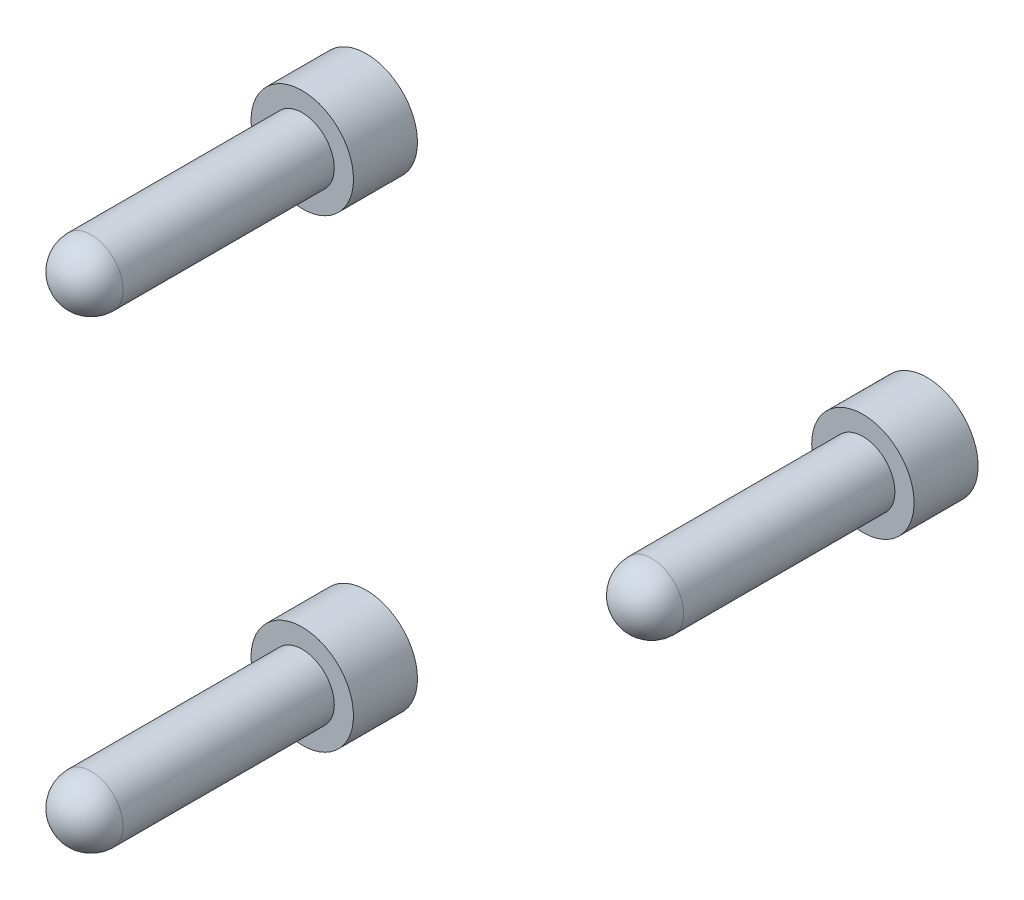
ISO-10303-21;
HEADER;
FILE_DESCRIPTION(('STEP AP214'),'2;1');
FILE_NAME('part.step','',(''),(''),'','','');
FILE_SCHEMA(('AUTOMOTIVE_DESIGN { 1 0 10303 214 1 1 1 1 }'));
ENDSEC;
DATA;
#1=APPLICATION_CONTEXT('core data for automotive mechanical design processes');
#2=APPLICATION_PROTOCOL_DEFINITION('international standard','automotive_design',2000,#1);
#3=PRODUCT_CONTEXT('',#1,'mechanical');
#4=PRODUCT('Part','Part','',(#3));
#5=PRODUCT_RELATED_PRODUCT_CATEGORY('part','',(#4));
#6=PRODUCT_DEFINITION_FORMATION('','',#4);
#7=PRODUCT_DEFINITION_CONTEXT('part definition',#1,'design');
#8=PRODUCT_DEFINITION('design','',#6,#7);
#9=PRODUCT_DEFINITION_SHAPE('','',#8);
#10=(LENGTH_UNIT() NAMED_UNIT(*) SI_UNIT(.MILLI.,.METRE.));
#11=(NAMED_UNIT(*) PLANE_ANGLE_UNIT() SI_UNIT($,.RADIAN.));
#12=(NAMED_UNIT(*) SI_UNIT($,.STERADIAN.) SOLID_ANGLE_UNIT());
#13=UNCERTAINTY_MEASURE_WITH_UNIT(LENGTH_MEASURE(1.E-05),#10,'distance_accuracy_value','');
#14=(GEOMETRIC_REPRESENTATION_CONTEXT(3) GLOBAL_UNCERTAINTY_ASSIGNED_CONTEXT((#13)) GLOBAL_UNIT_ASSIGNED_CONTEXT((#10,
#11,#12)) REPRESENTATION_CONTEXT('',''));
#15=CARTESIAN_POINT('',(0.,0.,0.));
#16=DIRECTION('',(0.,0.,1.));
#17=DIRECTION('',(1.,0.,0.));
#18=AXIS2_PLACEMENT_3D('',#15,#16,#17);
#19=CARTESIAN_POINT('',(21.9,16.9,5.));
#20=DIRECTION('',(0.,0.,-1.));
#21=DIRECTION('',(-1.,0.,0.));
#22=AXIS2_PLACEMENT_3D('',#19,#20,#21);
#23=CYLINDRICAL_SURFACE('',#22,4.);
#24=CARTESIAN_POINT('',(21.9,16.9,5.));
#25=DIRECTION('',(0.,0.,1.));
#26=DIRECTION('',(-1.,0.,0.));
#27=AXIS2_PLACEMENT_3D('',#24,#25,#26);
#28=CIRCLE('',#27,4.);
#29=CARTESIAN_POINT('',(17.9,16.9,5.));
#30=VERTEX_POINT('',#29);
#31=EDGE_CURVE('E60',#30,#30,#28,.T.);
#32=ORIENTED_EDGE('',*,*,#31,.F.);
#33=EDGE_LOOP('',(#32));
#34=FACE_BOUND('',#33,.T.);
#35=CARTESIAN_POINT('',(21.9,16.9,0.));
#36=DIRECTION('',(0.,0.,1.));
#37=DIRECTION('',(-1.,0.,0.));
#38=AXIS2_PLACEMENT_3D('',#35,#36,#37);
#39=CIRCLE('',#38,4.);
#40=CARTESIAN_POINT('',(17.9,16.9,0.));
#41=VERTEX_POINT('',#40);
#42=EDGE_CURVE('E55',#41,#41,#39,.T.);
#43=ORIENTED_EDGE('',*,*,#42,.T.);
#44=EDGE_LOOP('',(#43));
#45=FACE_BOUND('',#44,.T.);
#46=ADVANCED_FACE('F44',(#34,#45),#23,.T.);
#47=CARTESIAN_POINT('',(21.9,16.9,5.));
#48=DIRECTION('',(0.,0.,-1.));
#49=DIRECTION('',(-1.,0.,0.));
#50=AXIS2_PLACEMENT_3D('',#47,#48,#49);
#51=PLANE('',#50);
#52=CARTESIAN_POINT('',(21.9,16.9,5.));
#53=DIRECTION('',(0.,0.,1.));
#54=DIRECTION('',(1.,0.,0.));
#55=AXIS2_PLACEMENT_3D('',#52,#53,#54);
#56=CIRCLE('',#55,2.5);
#57=CARTESIAN_POINT('',(24.4,16.9,5.));
#58=VERTEX_POINT('',#57);
#59=EDGE_CURVE('E51',#58,#58,#56,.T.);
#60=ORIENTED_EDGE('',*,*,#59,.F.);
#61=EDGE_LOOP('',(#60));
#62=FACE_BOUND('',#61,.T.);
#63=ORIENTED_EDGE('',*,*,#31,.T.);
#64=EDGE_LOOP('',(#63));
#65=FACE_BOUND('',#64,.T.);
#66=ADVANCED_FACE('F65',(#62,#65),#51,.F.);
#67=CARTESIAN_POINT('',(21.9,16.9,0.));
#68=DIRECTION('',(0.,0.,-1.));
#69=DIRECTION('',(-1.,0.,0.));
#70=AXIS2_PLACEMENT_3D('',#67,#68,#69);
#71=PLANE('',#70);
#72=ORIENTED_EDGE('',*,*,#42,.F.);
#73=EDGE_LOOP('',(#72));
#74=FACE_BOUND('',#73,.T.);
#75=ADVANCED_FACE('F72',(#74),#71,.T.);
#76=CARTESIAN_POINT('',(21.9,16.9,24.));
#77=DIRECTION('',(0.,0.,-1.));
#78=DIRECTION('',(-1.,0.,0.));
#79=AXIS2_PLACEMENT_3D('',#76,#77,#78);
#80=CYLINDRICAL_SURFACE('',#79,2.5);
#81=CARTESIAN_POINT('',(21.9,16.9,21.5));
#82=DIRECTION('',(0.,0.,-1.));
#83=DIRECTION('',(-1.,0.,0.));
#84=AXIS2_PLACEMENT_3D('',#81,#82,#83);
#85=CIRCLE('',#84,2.5);
#86=CARTESIAN_POINT('',(19.4,16.9,21.5));
#87=VERTEX_POINT('',#86);
#88=EDGE_CURVE('E11',#87,#87,#85,.T.);
#89=ORIENTED_EDGE('',*,*,#88,.T.);
#90=EDGE_LOOP('',(#89));
#91=FACE_BOUND('',#90,.T.);
#92=ORIENTED_EDGE('',*,*,#59,.T.);
#93=EDGE_LOOP('',(#92));
#94=FACE_BOUND('',#93,.T.);
#95=ADVANCED_FACE('F74',(#91,#94),#80,.T.);
#96=CARTESIAN_POINT('',(21.9,16.9,21.5));
#97=DIRECTION('',(0.,0.,1.));
#98=DIRECTION('',(1.,0.,0.));
#99=AXIS2_PLACEMENT_3D('',#96,#97,#98);
#100=SPHERICAL_SURFACE('',#99,2.5);
#101=ORIENTED_EDGE('',*,*,#88,.F.);
#102=EDGE_LOOP('',(#101));
#103=FACE_BOUND('',#102,.T.);
#104=ADVANCED_FACE('F46',(#103),#100,.T.);
#105=CLOSED_SHELL('',(#46,#66,#75,#95,#104));
#106=MANIFOLD_SOLID_BREP('B2',#105);
#107=CARTESIAN_POINT('',(-21.9,-19.4,5.));
#108=DIRECTION('',(0.,0.,-1.));
#109=DIRECTION('',(-1.,0.,0.));
#110=AXIS2_PLACEMENT_3D('',#107,#108,#109);
#111=CYLINDRICAL_SURFACE('',#110,4.);
#112=CARTESIAN_POINT('',(-21.9,-19.4,5.));
#113=DIRECTION('',(0.,0.,1.));
#114=DIRECTION('',(1.,0.,0.));
#115=AXIS2_PLACEMENT_3D('',#112,#113,#114);
#116=CIRCLE('',#115,4.);
#117=CARTESIAN_POINT('',(-17.9,-19.4,5.));
#118=VERTEX_POINT('',#117);
#119=EDGE_CURVE('E148',#118,#118,#116,.T.);
#120=ORIENTED_EDGE('',*,*,#119,.F.);
#121=EDGE_LOOP('',(#120));
#122=FACE_BOUND('',#121,.T.);
#123=CARTESIAN_POINT('',(-21.9,-19.4,0.));
#124=DIRECTION('',(0.,0.,1.));
#125=DIRECTION('',(1.,0.,0.));
#126=AXIS2_PLACEMENT_3D('',#123,#124,#125);
#127=CIRCLE('',#126,4.);
#128=CARTESIAN_POINT('',(-17.9,-19.4,0.));
#129=VERTEX_POINT('',#128);
#130=EDGE_CURVE('E143',#129,#129,#127,.T.);
#131=ORIENTED_EDGE('',*,*,#130,.T.);
#132=EDGE_LOOP('',(#131));
#133=FACE_BOUND('',#132,.T.);
#134=ADVANCED_FACE('F132',(#122,#133),#111,.T.);
#135=CARTESIAN_POINT('',(-21.9,-19.4,5.));
#136=DIRECTION('',(0.,0.,1.));
#137=DIRECTION('',(1.,0.,0.));
#138=AXIS2_PLACEMENT_3D('',#135,#136,#137);
#139=PLANE('',#138);
#140=CARTESIAN_POINT('',(-21.9,-19.4,5.));
#141=DIRECTION('',(0.,0.,1.));
#142=DIRECTION('',(1.,0.,0.));
#143=AXIS2_PLACEMENT_3D('',#140,#141,#142);
#144=CIRCLE('',#143,2.5);
#145=CARTESIAN_POINT('',(-19.4,-19.4,5.));
#146=VERTEX_POINT('',#145);
#147=EDGE_CURVE('E139',#146,#146,#144,.T.);
#148=ORIENTED_EDGE('',*,*,#147,.F.);
#149=EDGE_LOOP('',(#148));
#150=FACE_BOUND('',#149,.T.);
#151=ORIENTED_EDGE('',*,*,#119,.T.);
#152=EDGE_LOOP('',(#151));
#153=FACE_BOUND('',#152,.T.);
#154=ADVANCED_FACE('F153',(#150,#153),#139,.T.);
#155=CARTESIAN_POINT('',(-21.9,-19.4,0.));
#156=DIRECTION('',(0.,0.,1.));
#157=DIRECTION('',(1.,0.,0.));
#158=AXIS2_PLACEMENT_3D('',#155,#156,#157);
#159=PLANE('',#158);
#160=ORIENTED_EDGE('',*,*,#130,.F.);
#161=EDGE_LOOP('',(#160));
#162=FACE_BOUND('',#161,.T.);
#163=ADVANCED_FACE('F160',(#162),#159,.F.);
#164=CARTESIAN_POINT('',(-21.9,-19.4,24.));
#165=DIRECTION('',(0.,0.,-1.));
#166=DIRECTION('',(-1.,0.,0.));
#167=AXIS2_PLACEMENT_3D('',#164,#165,#166);
#168=CYLINDRICAL_SURFACE('',#167,2.5);
#169=CARTESIAN_POINT('',(-21.9,-19.4,21.5));
#170=DIRECTION('',(0.,0.,-1.));
#171=DIRECTION('',(-1.,0.,0.));
#172=AXIS2_PLACEMENT_3D('',#169,#170,#171);
#173=CIRCLE('',#172,2.5);
#174=CARTESIAN_POINT('',(-24.4,-19.4,21.5));
#175=VERTEX_POINT('',#174);
#176=EDGE_CURVE('E43',#175,#175,#173,.T.);
#177=ORIENTED_EDGE('',*,*,#176,.T.);
#178=EDGE_LOOP('',(#177));
#179=FACE_BOUND('',#178,.T.);
#180=ORIENTED_EDGE('',*,*,#147,.T.);
#181=EDGE_LOOP('',(#180));
#182=FACE_BOUND('',#181,.T.);
#183=ADVANCED_FACE('F162',(#179,#182),#168,.T.);
#184=CARTESIAN_POINT('',(-21.9,-19.4,21.5));
#185=DIRECTION('',(0.,0.,1.));
#186=DIRECTION('',(1.,0.,0.));
#187=AXIS2_PLACEMENT_3D('',#184,#185,#186);
#188=SPHERICAL_SURFACE('',#187,2.5);
#189=ORIENTED_EDGE('',*,*,#176,.F.);
#190=EDGE_LOOP('',(#189));
#191=FACE_BOUND('',#190,.T.);
#192=ADVANCED_FACE('F134',(#191),#188,.T.);
#193=CLOSED_SHELL('',(#134,#154,#163,#183,#192));
#194=MANIFOLD_SOLID_BREP('B6',#193);
#195=CARTESIAN_POINT('',(-21.9,16.9,5.));
#196=DIRECTION('',(0.,0.,-1.));
#197=DIRECTION('',(-1.,0.,0.));
#198=AXIS2_PLACEMENT_3D('',#195,#196,#197);
#199=CYLINDRICAL_SURFACE('',#198,4.);
#200=CARTESIAN_POINT('',(-21.9,16.9,5.));
#201=DIRECTION('',(0.,0.,1.));
#202=DIRECTION('',(1.,0.,0.));
#203=AXIS2_PLACEMENT_3D('',#200,#201,#202);
#204=CIRCLE('',#203,4.);
#205=CARTESIAN_POINT('',(-17.9,16.9,5.));
#206=VERTEX_POINT('',#205);
#207=EDGE_CURVE('E224',#206,#206,#204,.T.);
#208=ORIENTED_EDGE('',*,*,#207,.F.);
#209=EDGE_LOOP('',(#208));
#210=FACE_BOUND('',#209,.T.);
#211=CARTESIAN_POINT('',(-21.9,16.9,0.));
#212=DIRECTION('',(0.,0.,1.));
#213=DIRECTION('',(1.,0.,0.));
#214=AXIS2_PLACEMENT_3D('',#211,#212,#213);
#215=CIRCLE('',#214,4.);
#216=CARTESIAN_POINT('',(-17.9,16.9,0.));
#217=VERTEX_POINT('',#216);
#218=EDGE_CURVE('E229',#217,#217,#215,.T.);
#219=ORIENTED_EDGE('',*,*,#218,.T.);
#220=EDGE_LOOP('',(#219));
#221=FACE_BOUND('',#220,.T.);
#222=ADVANCED_FACE('F213',(#210,#221),#199,.T.);
#223=CARTESIAN_POINT('',(-21.9,16.9,5.));
#224=DIRECTION('',(0.,0.,1.));
#225=DIRECTION('',(1.,0.,0.));
#226=AXIS2_PLACEMENT_3D('',#223,#224,#225);
#227=PLANE('',#226);
#228=CARTESIAN_POINT('',(-21.9,16.9,5.));
#229=DIRECTION('',(0.,0.,1.));
#230=DIRECTION('',(1.,0.,0.));
#231=AXIS2_PLACEMENT_3D('',#228,#229,#230);
#232=CIRCLE('',#231,2.5);
#233=CARTESIAN_POINT('',(-19.4,16.9,5.));
#234=VERTEX_POINT('',#233);
#235=EDGE_CURVE('E220',#234,#234,#232,.T.);
#236=ORIENTED_EDGE('',*,*,#235,.F.);
#237=EDGE_LOOP('',(#236));
#238=FACE_BOUND('',#237,.T.);
#239=ORIENTED_EDGE('',*,*,#207,.T.);
#240=EDGE_LOOP('',(#239));
#241=FACE_BOUND('',#240,.T.);
#242=ADVANCED_FACE('F238',(#238,#241),#227,.T.);
#243=CARTESIAN_POINT('',(-21.9,16.9,0.));
#244=DIRECTION('',(0.,0.,1.));
#245=DIRECTION('',(1.,0.,0.));
#246=AXIS2_PLACEMENT_3D('',#243,#244,#245);
#247=PLANE('',#246);
#248=ORIENTED_EDGE('',*,*,#218,.F.);
#249=EDGE_LOOP('',(#248));
#250=FACE_BOUND('',#249,.T.);
#251=ADVANCED_FACE('F235',(#250),#247,.F.);
#252=CARTESIAN_POINT('',(-21.9,16.9,24.));
#253=DIRECTION('',(0.,0.,-1.));
#254=DIRECTION('',(-1.,0.,0.));
#255=AXIS2_PLACEMENT_3D('',#252,#253,#254);
#256=CYLINDRICAL_SURFACE('',#255,2.5);
#257=CARTESIAN_POINT('',(-21.9,16.9,21.5));
#258=DIRECTION('',(0.,0.,-1.));
#259=DIRECTION('',(-1.,0.,0.));
#260=AXIS2_PLACEMENT_3D('',#257,#258,#259);
#261=CIRCLE('',#260,2.5);
#262=CARTESIAN_POINT('',(-24.4,16.9,21.5));
#263=VERTEX_POINT('',#262);
#264=EDGE_CURVE('E131',#263,#263,#261,.T.);
#265=ORIENTED_EDGE('',*,*,#264,.T.);
#266=EDGE_LOOP('',(#265));
#267=FACE_BOUND('',#266,.T.);
#268=ORIENTED_EDGE('',*,*,#235,.T.);
#269=EDGE_LOOP('',(#268));
#270=FACE_BOUND('',#269,.T.);
#271=ADVANCED_FACE('F237',(#267,#270),#256,.T.);
#272=CARTESIAN_POINT('',(-21.9,16.9,21.5));
#273=DIRECTION('',(0.,0.,1.));
#274=DIRECTION('',(1.,0.,0.));
#275=AXIS2_PLACEMENT_3D('',#272,#273,#274);
#276=SPHERICAL_SURFACE('',#275,2.5);
#277=ORIENTED_EDGE('',*,*,#264,.F.);
#278=EDGE_LOOP('',(#277));
#279=FACE_BOUND('',#278,.T.);
#280=ADVANCED_FACE('F215',(#279),#276,.T.);
#281=CLOSED_SHELL('',(#222,#242,#251,#271,#280));
#282=MANIFOLD_SOLID_BREP('B38',#281);
#283=ADVANCED_BREP_SHAPE_REPRESENTATION('',(#18,#106,#194,#282),#14);
#284=SHAPE_DEFINITION_REPRESENTATION(#9,#283);
ENDSEC;
END-ISO-10303-21;
